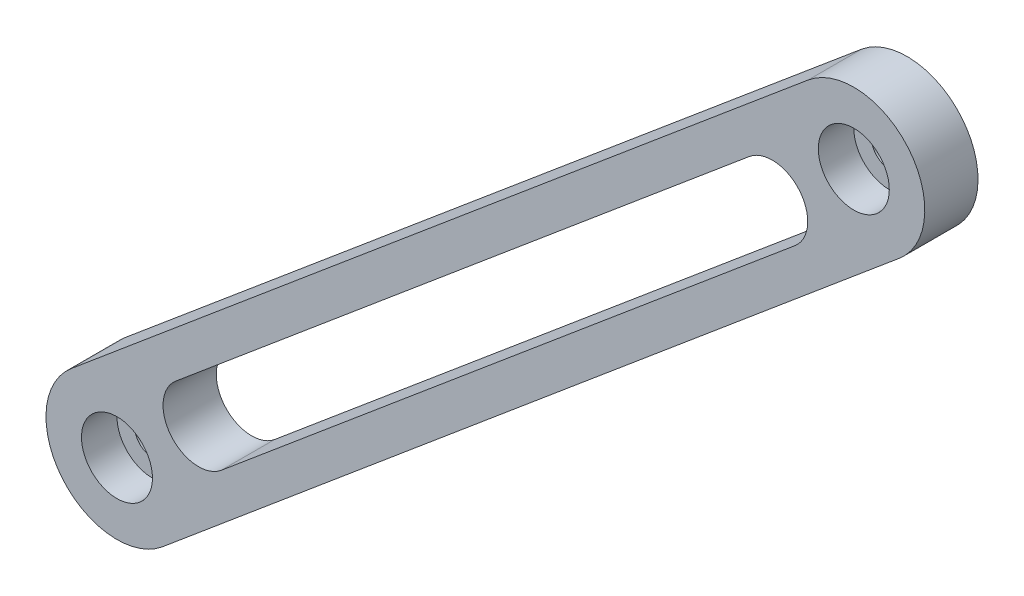
ISO-10303-21;
HEADER;
FILE_DESCRIPTION(('STEP AP214'),'2;1');
FILE_NAME('part.step','',(''),(''),'','','');
FILE_SCHEMA(('AUTOMOTIVE_DESIGN { 1 0 10303 214 1 1 1 1 }'));
ENDSEC;
DATA;
#1=APPLICATION_CONTEXT('core data for automotive mechanical design processes');
#2=APPLICATION_PROTOCOL_DEFINITION('international standard','automotive_design',2000,#1);
#3=PRODUCT_CONTEXT('',#1,'mechanical');
#4=PRODUCT('Part','Part','',(#3));
#5=PRODUCT_RELATED_PRODUCT_CATEGORY('part','',(#4));
#6=PRODUCT_DEFINITION_FORMATION('','',#4);
#7=PRODUCT_DEFINITION_CONTEXT('part definition',#1,'design');
#8=PRODUCT_DEFINITION('design','',#6,#7);
#9=PRODUCT_DEFINITION_SHAPE('','',#8);
#10=(LENGTH_UNIT() NAMED_UNIT(*) SI_UNIT(.MILLI.,.METRE.));
#11=(NAMED_UNIT(*) PLANE_ANGLE_UNIT() SI_UNIT($,.RADIAN.));
#12=(NAMED_UNIT(*) SI_UNIT($,.STERADIAN.) SOLID_ANGLE_UNIT());
#13=UNCERTAINTY_MEASURE_WITH_UNIT(LENGTH_MEASURE(1.E-05),#10,'distance_accuracy_value','');
#14=(GEOMETRIC_REPRESENTATION_CONTEXT(3) GLOBAL_UNCERTAINTY_ASSIGNED_CONTEXT((#13)) GLOBAL_UNIT_ASSIGNED_CONTEXT((#10,
#11,#12)) REPRESENTATION_CONTEXT('',''));
#15=CARTESIAN_POINT('',(0.,0.,0.));
#16=DIRECTION('',(0.,0.,1.));
#17=DIRECTION('',(1.,0.,0.));
#18=AXIS2_PLACEMENT_3D('',#15,#16,#17);
#19=CARTESIAN_POINT('',(584.67196600747,483.799194713962,19.05));
#20=DIRECTION('',(0.,0.,-1.));
#21=DIRECTION('',(-1.,0.,0.));
#22=AXIS2_PLACEMENT_3D('',#19,#20,#21);
#23=CYLINDRICAL_SURFACE('',#22,6.34999999999994);
#24=CARTESIAN_POINT('',(584.67196600747,483.799194713962,0.));
#25=DIRECTION('',(0.,0.,1.));
#26=DIRECTION('',(1.,0.,0.));
#27=AXIS2_PLACEMENT_3D('',#24,#25,#26);
#28=CIRCLE('',#27,6.34999999999994);
#29=CARTESIAN_POINT('',(578.32196600747,483.799194713962,0.));
#30=VERTEX_POINT('',#29);
#31=EDGE_CURVE('E119',#30,#30,#28,.T.);
#32=CARTESIAN_POINT('',(584.67196600747,483.799194713962,6.35));
#33=DIRECTION('',(0.,0.,1.));
#34=DIRECTION('',(1.,0.,0.));
#35=AXIS2_PLACEMENT_3D('',#32,#33,#34);
#36=CIRCLE('',#35,6.34999999999994);
#37=CARTESIAN_POINT('',(578.32196600747,483.799194713962,6.35));
#38=VERTEX_POINT('',#37);
#39=EDGE_CURVE('E40',#38,#38,#36,.T.);
#40=CARTESIAN_POINT('',(578.32196600747,483.799194713962,0.));
#41=CARTESIAN_POINT('',(578.32196600747,483.799194713962,0.0661458333333329));
#42=CARTESIAN_POINT('',(578.32196600747,483.799194713962,0.132291666666666));
#43=CARTESIAN_POINT('',(578.32196600747,483.799194713962,0.264583333333333));
#44=CARTESIAN_POINT('',(578.32196600747,483.799194713962,0.330729166666667));
#45=CARTESIAN_POINT('',(578.32196600747,483.799194713962,0.463020833333334));
#46=CARTESIAN_POINT('',(578.32196600747,483.799194713962,0.529166666666667));
#47=CARTESIAN_POINT('',(578.32196600747,483.799194713962,0.661458333333333));
#48=CARTESIAN_POINT('',(578.32196600747,483.799194713962,0.727604166666666));
#49=CARTESIAN_POINT('',(578.32196600747,483.799194713962,0.859895833333334));
#50=CARTESIAN_POINT('',(578.32196600747,483.799194713962,0.926041666666668));
#51=CARTESIAN_POINT('',(578.32196600747,483.799194713962,1.05833333333333));
#52=CARTESIAN_POINT('',(578.32196600747,483.799194713962,1.12447916666667));
#53=CARTESIAN_POINT('',(578.32196600747,483.799194713962,1.25677083333333));
#54=CARTESIAN_POINT('',(578.32196600747,483.799194713962,1.32291666666667));
#55=CARTESIAN_POINT('',(578.32196600747,483.799194713962,1.45520833333333));
#56=CARTESIAN_POINT('',(578.32196600747,483.799194713962,1.52135416666667));
#57=CARTESIAN_POINT('',(578.32196600747,483.799194713962,1.65364583333333));
#58=CARTESIAN_POINT('',(578.32196600747,483.799194713962,1.71979166666667));
#59=CARTESIAN_POINT('',(578.32196600747,483.799194713962,1.85208333333333));
#60=CARTESIAN_POINT('',(578.32196600747,483.799194713962,1.91822916666667));
#61=CARTESIAN_POINT('',(578.32196600747,483.799194713962,2.05052083333333));
#62=CARTESIAN_POINT('',(578.32196600747,483.799194713962,2.11666666666667));
#63=CARTESIAN_POINT('',(578.32196600747,483.799194713962,2.24895833333333));
#64=CARTESIAN_POINT('',(578.32196600747,483.799194713962,2.31510416666667));
#65=CARTESIAN_POINT('',(578.32196600747,483.799194713962,2.44739583333333));
#66=CARTESIAN_POINT('',(578.32196600747,483.799194713962,2.51354166666667));
#67=CARTESIAN_POINT('',(578.32196600747,483.799194713962,2.64583333333333));
#68=CARTESIAN_POINT('',(578.32196600747,483.799194713962,2.71197916666667));
#69=CARTESIAN_POINT('',(578.32196600747,483.799194713962,2.84427083333333));
#70=CARTESIAN_POINT('',(578.32196600747,483.799194713962,2.91041666666667));
#71=CARTESIAN_POINT('',(578.32196600747,483.799194713962,3.04270833333333));
#72=CARTESIAN_POINT('',(578.32196600747,483.799194713962,3.10885416666667));
#73=CARTESIAN_POINT('',(578.32196600747,483.799194713962,3.24114583333333));
#74=CARTESIAN_POINT('',(578.32196600747,483.799194713962,3.30729166666667));
#75=CARTESIAN_POINT('',(578.32196600747,483.799194713962,3.43958333333333));
#76=CARTESIAN_POINT('',(578.32196600747,483.799194713962,3.50572916666667));
#77=CARTESIAN_POINT('',(578.32196600747,483.799194713962,3.63802083333333));
#78=CARTESIAN_POINT('',(578.32196600747,483.799194713962,3.70416666666667));
#79=CARTESIAN_POINT('',(578.32196600747,483.799194713962,3.83645833333333));
#80=CARTESIAN_POINT('',(578.32196600747,483.799194713962,3.90260416666667));
#81=CARTESIAN_POINT('',(578.32196600747,483.799194713962,4.03489583333333));
#82=CARTESIAN_POINT('',(578.32196600747,483.799194713962,4.10104166666667));
#83=CARTESIAN_POINT('',(578.32196600747,483.799194713962,4.23333333333333));
#84=CARTESIAN_POINT('',(578.32196600747,483.799194713962,4.29947916666667));
#85=CARTESIAN_POINT('',(578.32196600747,483.799194713962,4.43177083333333));
#86=CARTESIAN_POINT('',(578.32196600747,483.799194713962,4.49791666666667));
#87=CARTESIAN_POINT('',(578.32196600747,483.799194713962,4.63020833333333));
#88=CARTESIAN_POINT('',(578.32196600747,483.799194713962,4.69635416666667));
#89=CARTESIAN_POINT('',(578.32196600747,483.799194713962,4.82864583333333));
#90=CARTESIAN_POINT('',(578.32196600747,483.799194713962,4.89479166666667));
#91=CARTESIAN_POINT('',(578.32196600747,483.799194713962,5.02708333333333));
#92=CARTESIAN_POINT('',(578.32196600747,483.799194713962,5.09322916666667));
#93=CARTESIAN_POINT('',(578.32196600747,483.799194713962,5.22552083333333));
#94=CARTESIAN_POINT('',(578.32196600747,483.799194713962,5.29166666666667));
#95=CARTESIAN_POINT('',(578.32196600747,483.799194713962,5.42395833333333));
#96=CARTESIAN_POINT('',(578.32196600747,483.799194713962,5.49010416666667));
#97=CARTESIAN_POINT('',(578.32196600747,483.799194713962,5.62239583333333));
#98=CARTESIAN_POINT('',(578.32196600747,483.799194713962,5.68854166666667));
#99=CARTESIAN_POINT('',(578.32196600747,483.799194713962,5.82083333333333));
#100=CARTESIAN_POINT('',(578.32196600747,483.799194713962,5.88697916666667));
#101=CARTESIAN_POINT('',(578.32196600747,483.799194713962,6.01927083333333));
#102=CARTESIAN_POINT('',(578.32196600747,483.799194713962,6.08541666666667));
#103=CARTESIAN_POINT('',(578.32196600747,483.799194713962,6.21770833333333));
#104=CARTESIAN_POINT('',(578.32196600747,483.799194713962,6.28385416666667));
#105=CARTESIAN_POINT('',(578.32196600747,483.799194713962,6.35));
#106=B_SPLINE_CURVE_WITH_KNOTS('',3,(#40,#41,#42,#43,#44,#45,#46,#47,#48,#49,#50,#51,#52,#53,
#54,#55,#56,#57,#58,#59,#60,#61,#62,#63,#64,#65,#66,#67,#68,#69,#70,#71,#72,#73,#74,#75,#76,#77,
#78,#79,#80,#81,#82,#83,#84,#85,#86,#87,#88,#89,#90,#91,#92,#93,#94,#95,#96,#97,#98,#99,#100,
#101,#102,#103,#104,#105),.UNSPECIFIED.,.F.,.F.,(4,2,2,2,2,2,2,2,2,2,2,2,2,2,2,2,2,2,2,2,2,2,2,
2,2,2,2,2,2,2,2,2,4),(0.,0.198437499999999,0.396875000000001,0.5953125,0.793749999999999,
0.992187500000002,1.190625,1.3890625,1.5875,1.7859375,1.984375,2.1828125,2.38125,2.5796875,
2.778125,2.9765625,3.175,3.3734375,3.571875,3.7703125,3.96875,4.1671875,4.365625,4.5640625,
4.7625,4.9609375,5.159375,5.3578125,5.55625,5.7546875,5.953125,6.1515625,6.35),.UNSPECIFIED.);
#107=EDGE_CURVE('BSEAM36',#30,#38,#106,.T.);
#108=ORIENTED_EDGE('',*,*,#31,.F.);
#109=ORIENTED_EDGE('',*,*,#39,.T.);
#110=ORIENTED_EDGE('',*,*,#107,.T.);
#111=ORIENTED_EDGE('',*,*,#107,.F.);
#112=EDGE_LOOP('',(#108,#110,#109,#111));
#113=FACE_BOUND('',#112,.T.);
#114=ADVANCED_FACE('F36',(#113),#23,.F.);
#115=CARTESIAN_POINT('',(321.022448189193,262.570981552578,19.05));
#116=DIRECTION('',(0.,0.,-1.));
#117=DIRECTION('',(-1.,0.,0.));
#118=AXIS2_PLACEMENT_3D('',#115,#116,#117);
#119=CYLINDRICAL_SURFACE('',#118,6.34999999999994);
#120=CARTESIAN_POINT('',(321.022448189193,262.570981552578,0.));
#121=DIRECTION('',(0.,0.,1.));
#122=DIRECTION('',(1.,0.,0.));
#123=AXIS2_PLACEMENT_3D('',#120,#121,#122);
#124=CIRCLE('',#123,6.34999999999994);
#125=CARTESIAN_POINT('',(314.672448189193,262.570981552578,0.));
#126=VERTEX_POINT('',#125);
#127=EDGE_CURVE('E133',#126,#126,#124,.T.);
#128=CARTESIAN_POINT('',(321.022448189193,262.570981552578,6.35));
#129=DIRECTION('',(0.,0.,1.));
#130=DIRECTION('',(1.,0.,0.));
#131=AXIS2_PLACEMENT_3D('',#128,#129,#130);
#132=CIRCLE('',#131,6.34999999999994);
#133=CARTESIAN_POINT('',(314.672448189193,262.570981552578,6.35));
#134=VERTEX_POINT('',#133);
#135=EDGE_CURVE('E170',#134,#134,#132,.T.);
#136=CARTESIAN_POINT('',(314.672448189193,262.570981552578,0.));
#137=CARTESIAN_POINT('',(314.672448189193,262.570981552578,0.0661458333333329));
#138=CARTESIAN_POINT('',(314.672448189193,262.570981552578,0.132291666666666));
#139=CARTESIAN_POINT('',(314.672448189193,262.570981552578,0.264583333333333));
#140=CARTESIAN_POINT('',(314.672448189193,262.570981552578,0.330729166666667));
#141=CARTESIAN_POINT('',(314.672448189193,262.570981552578,0.463020833333334));
#142=CARTESIAN_POINT('',(314.672448189193,262.570981552578,0.529166666666667));
#143=CARTESIAN_POINT('',(314.672448189193,262.570981552578,0.661458333333333));
#144=CARTESIAN_POINT('',(314.672448189193,262.570981552578,0.727604166666666));
#145=CARTESIAN_POINT('',(314.672448189193,262.570981552578,0.859895833333334));
#146=CARTESIAN_POINT('',(314.672448189193,262.570981552578,0.926041666666668));
#147=CARTESIAN_POINT('',(314.672448189193,262.570981552578,1.05833333333333));
#148=CARTESIAN_POINT('',(314.672448189193,262.570981552578,1.12447916666667));
#149=CARTESIAN_POINT('',(314.672448189193,262.570981552578,1.25677083333333));
#150=CARTESIAN_POINT('',(314.672448189193,262.570981552578,1.32291666666667));
#151=CARTESIAN_POINT('',(314.672448189193,262.570981552578,1.45520833333333));
#152=CARTESIAN_POINT('',(314.672448189193,262.570981552578,1.52135416666667));
#153=CARTESIAN_POINT('',(314.672448189193,262.570981552578,1.65364583333333));
#154=CARTESIAN_POINT('',(314.672448189193,262.570981552578,1.71979166666667));
#155=CARTESIAN_POINT('',(314.672448189193,262.570981552578,1.85208333333333));
#156=CARTESIAN_POINT('',(314.672448189193,262.570981552578,1.91822916666667));
#157=CARTESIAN_POINT('',(314.672448189193,262.570981552578,2.05052083333333));
#158=CARTESIAN_POINT('',(314.672448189193,262.570981552578,2.11666666666667));
#159=CARTESIAN_POINT('',(314.672448189193,262.570981552578,2.24895833333333));
#160=CARTESIAN_POINT('',(314.672448189193,262.570981552578,2.31510416666667));
#161=CARTESIAN_POINT('',(314.672448189193,262.570981552578,2.44739583333333));
#162=CARTESIAN_POINT('',(314.672448189193,262.570981552578,2.51354166666667));
#163=CARTESIAN_POINT('',(314.672448189193,262.570981552578,2.64583333333333));
#164=CARTESIAN_POINT('',(314.672448189193,262.570981552578,2.71197916666667));
#165=CARTESIAN_POINT('',(314.672448189193,262.570981552578,2.84427083333333));
#166=CARTESIAN_POINT('',(314.672448189193,262.570981552578,2.91041666666667));
#167=CARTESIAN_POINT('',(314.672448189193,262.570981552578,3.04270833333333));
#168=CARTESIAN_POINT('',(314.672448189193,262.570981552578,3.10885416666667));
#169=CARTESIAN_POINT('',(314.672448189193,262.570981552578,3.24114583333333));
#170=CARTESIAN_POINT('',(314.672448189193,262.570981552578,3.30729166666667));
#171=CARTESIAN_POINT('',(314.672448189193,262.570981552578,3.43958333333333));
#172=CARTESIAN_POINT('',(314.672448189193,262.570981552578,3.50572916666667));
#173=CARTESIAN_POINT('',(314.672448189193,262.570981552578,3.63802083333333));
#174=CARTESIAN_POINT('',(314.672448189193,262.570981552578,3.70416666666667));
#175=CARTESIAN_POINT('',(314.672448189193,262.570981552578,3.83645833333333));
#176=CARTESIAN_POINT('',(314.672448189193,262.570981552578,3.90260416666667));
#177=CARTESIAN_POINT('',(314.672448189193,262.570981552578,4.03489583333333));
#178=CARTESIAN_POINT('',(314.672448189193,262.570981552578,4.10104166666667));
#179=CARTESIAN_POINT('',(314.672448189193,262.570981552578,4.23333333333333));
#180=CARTESIAN_POINT('',(314.672448189193,262.570981552578,4.29947916666667));
#181=CARTESIAN_POINT('',(314.672448189193,262.570981552578,4.43177083333333));
#182=CARTESIAN_POINT('',(314.672448189193,262.570981552578,4.49791666666667));
#183=CARTESIAN_POINT('',(314.672448189193,262.570981552578,4.63020833333333));
#184=CARTESIAN_POINT('',(314.672448189193,262.570981552578,4.69635416666667));
#185=CARTESIAN_POINT('',(314.672448189193,262.570981552578,4.82864583333333));
#186=CARTESIAN_POINT('',(314.672448189193,262.570981552578,4.89479166666667));
#187=CARTESIAN_POINT('',(314.672448189193,262.570981552578,5.02708333333333));
#188=CARTESIAN_POINT('',(314.672448189193,262.570981552578,5.09322916666667));
#189=CARTESIAN_POINT('',(314.672448189193,262.570981552578,5.22552083333333));
#190=CARTESIAN_POINT('',(314.672448189193,262.570981552578,5.29166666666667));
#191=CARTESIAN_POINT('',(314.672448189193,262.570981552578,5.42395833333333));
#192=CARTESIAN_POINT('',(314.672448189193,262.570981552578,5.49010416666667));
#193=CARTESIAN_POINT('',(314.672448189193,262.570981552578,5.62239583333333));
#194=CARTESIAN_POINT('',(314.672448189193,262.570981552578,5.68854166666667));
#195=CARTESIAN_POINT('',(314.672448189193,262.570981552578,5.82083333333333));
#196=CARTESIAN_POINT('',(314.672448189193,262.570981552578,5.88697916666667));
#197=CARTESIAN_POINT('',(314.672448189193,262.570981552578,6.01927083333333));
#198=CARTESIAN_POINT('',(314.672448189193,262.570981552578,6.08541666666667));
#199=CARTESIAN_POINT('',(314.672448189193,262.570981552578,6.21770833333333));
#200=CARTESIAN_POINT('',(314.672448189193,262.570981552578,6.28385416666667));
#201=CARTESIAN_POINT('',(314.672448189193,262.570981552578,6.35));
#202=B_SPLINE_CURVE_WITH_KNOTS('',3,(#136,#137,#138,#139,#140,#141,#142,#143,#144,#145,#146,
#147,#148,#149,#150,#151,#152,#153,#154,#155,#156,#157,#158,#159,#160,#161,#162,#163,#164,#165,
#166,#167,#168,#169,#170,#171,#172,#173,#174,#175,#176,#177,#178,#179,#180,#181,#182,#183,#184,
#185,#186,#187,#188,#189,#190,#191,#192,#193,#194,#195,#196,#197,#198,#199,#200,#201),
.UNSPECIFIED.,.F.,.F.,(4,2,2,2,2,2,2,2,2,2,2,2,2,2,2,2,2,2,2,2,2,2,2,2,2,2,2,2,2,2,2,2,4),(0.,
0.198437499999999,0.396875000000001,0.5953125,0.793749999999999,0.992187500000002,1.190625,
1.3890625,1.5875,1.7859375,1.984375,2.1828125,2.38125,2.5796875,2.778125,2.9765625,3.175,
3.3734375,3.571875,3.7703125,3.96875,4.1671875,4.365625,4.5640625,4.7625,4.9609375,5.159375,
5.3578125,5.55625,5.7546875,5.953125,6.1515625,6.35),.UNSPECIFIED.);
#203=EDGE_CURVE('BSEAM194',#126,#134,#202,.T.);
#204=ORIENTED_EDGE('',*,*,#127,.F.);
#205=ORIENTED_EDGE('',*,*,#135,.T.);
#206=ORIENTED_EDGE('',*,*,#203,.T.);
#207=ORIENTED_EDGE('',*,*,#203,.F.);
#208=EDGE_LOOP('',(#204,#206,#205,#207));
#209=FACE_BOUND('',#208,.T.);
#210=ADVANCED_FACE('F194',(#209),#119,.F.);
#211=CARTESIAN_POINT('',(321.022450019211,262.570983088146,19.05));
#212=DIRECTION('',(0.,0.,1.));
#213=DIRECTION('',(1.,0.,0.));
#214=AXIS2_PLACEMENT_3D('',#211,#212,#213);
#215=PLANE('',#214);
#216=CARTESIAN_POINT('',(321.022448189193,262.570981552578,19.05));
#217=DIRECTION('',(0.,0.,1.));
#218=DIRECTION('',(1.,0.,0.));
#219=AXIS2_PLACEMENT_3D('',#216,#217,#218);
#220=CIRCLE('',#219,12.7);
#221=CARTESIAN_POINT('',(333.722448189193,262.570981552578,19.05));
#222=VERTEX_POINT('',#221);
#223=EDGE_CURVE('E177',#222,#222,#220,.T.);
#224=ORIENTED_EDGE('',*,*,#223,.F.);
#225=EDGE_LOOP('',(#224));
#226=FACE_BOUND('',#225,.T.);
#227=CARTESIAN_POINT('',(584.67196600747,483.799194713962,19.05));
#228=DIRECTION('',(0.,0.,1.));
#229=DIRECTION('',(1.,0.,0.));
#230=AXIS2_PLACEMENT_3D('',#227,#228,#229);
#231=CIRCLE('',#230,12.7);
#232=CARTESIAN_POINT('',(597.37196600747,483.799194713962,19.05));
#233=VERTEX_POINT('',#232);
#234=EDGE_CURVE('E187',#233,#233,#231,.T.);
#235=ORIENTED_EDGE('',*,*,#234,.F.);
#236=EDGE_LOOP('',(#235));
#237=FACE_BOUND('',#236,.T.);
#238=DIRECTION('',(-0.766044443118976,-0.642787609686541,0.));
#239=VECTOR('',#238,1.);
#240=CARTESIAN_POINT('',(547.322270081617,469.037751212516,19.05));
#241=LINE('',#240,#239);
#242=CARTESIAN_POINT('',(547.322270081617,469.037751212516,19.05));
#243=VERTEX_POINT('',#242);
#244=CARTESIAN_POINT('',(342.045340659025,296.789955444813,19.05));
#245=VERTEX_POINT('',#244);
#246=EDGE_CURVE('E111',#243,#245,#241,.T.);
#247=ORIENTED_EDGE('',*,*,#246,.F.);
#248=CARTESIAN_POINT('',(555.485672724636,459.308986784905,19.05));
#249=DIRECTION('',(0.,0.,1.));
#250=DIRECTION('',(1.,0.,0.));
#251=AXIS2_PLACEMENT_3D('',#248,#249,#250);
#252=CIRCLE('',#251,12.6999999999998);
#253=CARTESIAN_POINT('',(563.649075367655,449.580222357294,19.05));
#254=VERTEX_POINT('',#253);
#255=EDGE_CURVE('E103',#254,#243,#252,.T.);
#256=ORIENTED_EDGE('',*,*,#255,.F.);
#257=DIRECTION('',(0.766044443118976,0.642787609686542,0.));
#258=VECTOR('',#257,1.);
#259=CARTESIAN_POINT('',(563.649075367655,449.580222357294,19.05));
#260=LINE('',#259,#258);
#261=CARTESIAN_POINT('',(358.372145945064,277.332426589591,19.05));
#262=VERTEX_POINT('',#261);
#263=EDGE_CURVE('E127',#262,#254,#260,.T.);
#264=ORIENTED_EDGE('',*,*,#263,.F.);
#265=CARTESIAN_POINT('',(350.208743302045,287.061191017202,19.05));
#266=DIRECTION('',(0.,0.,1.));
#267=DIRECTION('',(1.,0.,0.));
#268=AXIS2_PLACEMENT_3D('',#265,#266,#267);
#269=CIRCLE('',#268,12.6999999999999);
#270=EDGE_CURVE('E125',#245,#262,#269,.T.);
#271=ORIENTED_EDGE('',*,*,#270,.F.);
#272=EDGE_LOOP('',(#247,#256,#264,#271));
#273=FACE_BOUND('',#272,.T.);
#274=CARTESIAN_POINT('',(321.022450019211,262.570983088146,19.05));
#275=DIRECTION('',(0.,0.,1.));
#276=DIRECTION('',(1.,0.,0.));
#277=AXIS2_PLACEMENT_3D('',#274,#275,#276);
#278=CIRCLE('',#277,25.4000000000003);
#279=CARTESIAN_POINT('',(304.695644733173,282.028511943368,19.05));
#280=VERTEX_POINT('',#279);
#281=CARTESIAN_POINT('',(337.349251645213,243.113451161788,19.05));
#282=VERTEX_POINT('',#281);
#283=EDGE_CURVE('E146',#280,#282,#278,.T.);
#284=ORIENTED_EDGE('',*,*,#283,.T.);
#285=DIRECTION('',(0.766044443118978,0.64278760968654,0.));
#286=VECTOR('',#285,1.);
#287=CARTESIAN_POINT('',(600.998771293508,464.34166585874,19.05));
#288=LINE('',#287,#286);
#289=CARTESIAN_POINT('',(600.998771293508,464.34166585874,19.05));
#290=VERTEX_POINT('',#289);
#291=EDGE_CURVE('E149',#282,#290,#288,.T.);
#292=ORIENTED_EDGE('',*,*,#291,.T.);
#293=CARTESIAN_POINT('',(584.67196600747,483.799194713962,19.05));
#294=DIRECTION('',(0.,0.,1.));
#295=DIRECTION('',(-1.,0.,0.));
#296=AXIS2_PLACEMENT_3D('',#293,#294,#295);
#297=CIRCLE('',#296,25.4);
#298=CARTESIAN_POINT('',(568.345160721432,503.256723569184,19.05));
#299=VERTEX_POINT('',#298);
#300=EDGE_CURVE('E152',#290,#299,#297,.T.);
#301=ORIENTED_EDGE('',*,*,#300,.T.);
#302=DIRECTION('',(-0.766044443118978,-0.642787609686539,0.));
#303=VECTOR('',#302,1.);
#304=CARTESIAN_POINT('',(568.345160721432,503.256723569184,19.05));
#305=LINE('',#304,#303);
#306=EDGE_CURVE('E154',#299,#280,#305,.T.);
#307=ORIENTED_EDGE('',*,*,#306,.T.);
#308=EDGE_LOOP('',(#284,#292,#301,#307));
#309=FACE_BOUND('',#308,.T.);
#310=ADVANCED_FACE('F123',(#226,#237,#273,#309),#215,.T.);
#311=CARTESIAN_POINT('',(321.022450019211,262.570983088146,0.));
#312=DIRECTION('',(0.,0.,1.));
#313=DIRECTION('',(1.,0.,0.));
#314=AXIS2_PLACEMENT_3D('',#311,#312,#313);
#315=PLANE('',#314);
#316=ORIENTED_EDGE('',*,*,#31,.T.);
#317=EDGE_LOOP('',(#316));
#318=FACE_BOUND('',#317,.T.);
#319=CARTESIAN_POINT('',(321.022450019211,262.570983088146,0.));
#320=DIRECTION('',(0.,0.,1.));
#321=DIRECTION('',(1.,0.,0.));
#322=AXIS2_PLACEMENT_3D('',#319,#320,#321);
#323=CIRCLE('',#322,25.4000000000003);
#324=CARTESIAN_POINT('',(304.695644733173,282.028511943368,0.));
#325=VERTEX_POINT('',#324);
#326=CARTESIAN_POINT('',(337.349251645213,243.113451161788,0.));
#327=VERTEX_POINT('',#326);
#328=EDGE_CURVE('E145',#325,#327,#323,.T.);
#329=ORIENTED_EDGE('',*,*,#328,.F.);
#330=DIRECTION('',(-0.766044443118978,-0.642787609686539,0.));
#331=VECTOR('',#330,1.);
#332=CARTESIAN_POINT('',(568.345160721432,503.256723569184,0.));
#333=LINE('',#332,#331);
#334=CARTESIAN_POINT('',(568.345160721432,503.256723569184,0.));
#335=VERTEX_POINT('',#334);
#336=EDGE_CURVE('E150',#335,#325,#333,.T.);
#337=ORIENTED_EDGE('',*,*,#336,.F.);
#338=CARTESIAN_POINT('',(584.67196600747,483.799194713962,0.));
#339=DIRECTION('',(0.,0.,1.));
#340=DIRECTION('',(-1.,0.,0.));
#341=AXIS2_PLACEMENT_3D('',#338,#339,#340);
#342=CIRCLE('',#341,25.4);
#343=CARTESIAN_POINT('',(600.998771293508,464.34166585874,0.));
#344=VERTEX_POINT('',#343);
#345=EDGE_CURVE('E161',#344,#335,#342,.T.);
#346=ORIENTED_EDGE('',*,*,#345,.F.);
#347=DIRECTION('',(0.766044443118978,0.64278760968654,0.));
#348=VECTOR('',#347,1.);
#349=CARTESIAN_POINT('',(600.998771293508,464.34166585874,0.));
#350=LINE('',#349,#348);
#351=EDGE_CURVE('E159',#327,#344,#350,.T.);
#352=ORIENTED_EDGE('',*,*,#351,.F.);
#353=EDGE_LOOP('',(#329,#337,#346,#352));
#354=FACE_BOUND('',#353,.T.);
#355=CARTESIAN_POINT('',(555.485672724636,459.308986784905,0.));
#356=DIRECTION('',(0.,0.,1.));
#357=DIRECTION('',(1.,0.,0.));
#358=AXIS2_PLACEMENT_3D('',#355,#356,#357);
#359=CIRCLE('',#358,12.6999999999998);
#360=CARTESIAN_POINT('',(563.649075367655,449.580222357294,0.));
#361=VERTEX_POINT('',#360);
#362=CARTESIAN_POINT('',(547.322270081617,469.037751212516,0.));
#363=VERTEX_POINT('',#362);
#364=EDGE_CURVE('E61',#361,#363,#359,.T.);
#365=ORIENTED_EDGE('',*,*,#364,.T.);
#366=DIRECTION('',(-0.766044443118976,-0.642787609686541,0.));
#367=VECTOR('',#366,1.);
#368=CARTESIAN_POINT('',(547.322270081617,469.037751212516,0.));
#369=LINE('',#368,#367);
#370=CARTESIAN_POINT('',(342.045340659025,296.789955444813,0.));
#371=VERTEX_POINT('',#370);
#372=EDGE_CURVE('E118',#363,#371,#369,.T.);
#373=ORIENTED_EDGE('',*,*,#372,.T.);
#374=CARTESIAN_POINT('',(350.208743302045,287.061191017202,0.));
#375=DIRECTION('',(0.,0.,1.));
#376=DIRECTION('',(1.,0.,0.));
#377=AXIS2_PLACEMENT_3D('',#374,#375,#376);
#378=CIRCLE('',#377,12.6999999999999);
#379=CARTESIAN_POINT('',(358.372145945064,277.332426589591,0.));
#380=VERTEX_POINT('',#379);
#381=EDGE_CURVE('E135',#371,#380,#378,.T.);
#382=ORIENTED_EDGE('',*,*,#381,.T.);
#383=DIRECTION('',(0.766044443118976,0.642787609686542,0.));
#384=VECTOR('',#383,1.);
#385=CARTESIAN_POINT('',(563.649075367655,449.580222357294,0.));
#386=LINE('',#385,#384);
#387=EDGE_CURVE('E112',#380,#361,#386,.T.);
#388=ORIENTED_EDGE('',*,*,#387,.T.);
#389=EDGE_LOOP('',(#365,#373,#382,#388));
#390=FACE_BOUND('',#389,.T.);
#391=ORIENTED_EDGE('',*,*,#127,.T.);
#392=EDGE_LOOP('',(#391));
#393=FACE_BOUND('',#392,.T.);
#394=ADVANCED_FACE('F192',(#318,#354,#390,#393),#315,.F.);
#395=CARTESIAN_POINT('',(321.022450019211,262.570983088146,19.05));
#396=DIRECTION('',(0.,0.,-1.));
#397=DIRECTION('',(-1.,0.,0.));
#398=AXIS2_PLACEMENT_3D('',#395,#396,#397);
#399=CYLINDRICAL_SURFACE('',#398,25.4000000000003);
#400=ORIENTED_EDGE('',*,*,#328,.T.);
#401=DIRECTION('',(0.,0.,-1.));
#402=VECTOR('',#401,1.);
#403=CARTESIAN_POINT('',(337.349251645213,243.113451161788,19.05));
#404=LINE('',#403,#402);
#405=EDGE_CURVE('E11',#282,#327,#404,.T.);
#406=ORIENTED_EDGE('',*,*,#405,.F.);
#407=ORIENTED_EDGE('',*,*,#283,.F.);
#408=DIRECTION('',(0.,0.,-1.));
#409=VECTOR('',#408,1.);
#410=CARTESIAN_POINT('',(304.695644733173,282.028511943368,19.05));
#411=LINE('',#410,#409);
#412=EDGE_CURVE('E156',#280,#325,#411,.T.);
#413=ORIENTED_EDGE('',*,*,#412,.T.);
#414=EDGE_LOOP('',(#400,#406,#407,#413));
#415=FACE_BOUND('',#414,.T.);
#416=ADVANCED_FACE('F38',(#415),#399,.T.);
#417=CARTESIAN_POINT('',(600.998771293508,464.34166585874,19.05));
#418=DIRECTION('',(-0.64278760968654,0.766044443118978,0.));
#419=DIRECTION('',(-0.766044443118978,-0.64278760968654,0.));
#420=AXIS2_PLACEMENT_3D('',#417,#418,#419);
#421=PLANE('',#420);
#422=ORIENTED_EDGE('',*,*,#351,.T.);
#423=DIRECTION('',(0.,0.,-1.));
#424=VECTOR('',#423,1.);
#425=CARTESIAN_POINT('',(600.998771293508,464.34166585874,19.05));
#426=LINE('',#425,#424);
#427=EDGE_CURVE('E45',#290,#344,#426,.T.);
#428=ORIENTED_EDGE('',*,*,#427,.F.);
#429=ORIENTED_EDGE('',*,*,#291,.F.);
#430=ORIENTED_EDGE('',*,*,#405,.T.);
#431=EDGE_LOOP('',(#422,#428,#429,#430));
#432=FACE_BOUND('',#431,.T.);
#433=ADVANCED_FACE('F230',(#432),#421,.F.);
#434=CARTESIAN_POINT('',(584.67196600747,483.799194713962,19.05));
#435=DIRECTION('',(0.,0.,-1.));
#436=DIRECTION('',(-1.,0.,0.));
#437=AXIS2_PLACEMENT_3D('',#434,#435,#436);
#438=CYLINDRICAL_SURFACE('',#437,25.4);
#439=ORIENTED_EDGE('',*,*,#345,.T.);
#440=DIRECTION('',(0.,0.,-1.));
#441=VECTOR('',#440,1.);
#442=CARTESIAN_POINT('',(568.345160721432,503.256723569184,19.05));
#443=LINE('',#442,#441);
#444=EDGE_CURVE('E166',#299,#335,#443,.T.);
#445=ORIENTED_EDGE('',*,*,#444,.F.);
#446=ORIENTED_EDGE('',*,*,#300,.F.);
#447=ORIENTED_EDGE('',*,*,#427,.T.);
#448=EDGE_LOOP('',(#439,#445,#446,#447));
#449=FACE_BOUND('',#448,.T.);
#450=ADVANCED_FACE('F227',(#449),#438,.T.);
#451=CARTESIAN_POINT('',(568.345160721432,503.256723569184,19.05));
#452=DIRECTION('',(0.642787609686539,-0.766044443118978,0.));
#453=DIRECTION('',(0.766044443118978,0.642787609686539,0.));
#454=AXIS2_PLACEMENT_3D('',#451,#452,#453);
#455=PLANE('',#454);
#456=ORIENTED_EDGE('',*,*,#336,.T.);
#457=ORIENTED_EDGE('',*,*,#412,.F.);
#458=ORIENTED_EDGE('',*,*,#306,.F.);
#459=ORIENTED_EDGE('',*,*,#444,.T.);
#460=EDGE_LOOP('',(#456,#457,#458,#459));
#461=FACE_BOUND('',#460,.T.);
#462=ADVANCED_FACE('F220',(#461),#455,.F.);
#463=CARTESIAN_POINT('',(555.485672724636,459.308986784905,19.05));
#464=DIRECTION('',(0.,0.,-1.));
#465=DIRECTION('',(-1.,0.,0.));
#466=AXIS2_PLACEMENT_3D('',#463,#464,#465);
#467=CYLINDRICAL_SURFACE('',#466,12.6999999999998);
#468=ORIENTED_EDGE('',*,*,#364,.F.);
#469=DIRECTION('',(0.,0.,-1.));
#470=VECTOR('',#469,1.);
#471=CARTESIAN_POINT('',(563.649075367655,449.580222357294,19.05));
#472=LINE('',#471,#470);
#473=EDGE_CURVE('E107',#254,#361,#472,.T.);
#474=ORIENTED_EDGE('',*,*,#473,.F.);
#475=ORIENTED_EDGE('',*,*,#255,.T.);
#476=DIRECTION('',(0.,0.,-1.));
#477=VECTOR('',#476,1.);
#478=CARTESIAN_POINT('',(547.322270081617,469.037751212516,19.05));
#479=LINE('',#478,#477);
#480=EDGE_CURVE('E106',#243,#363,#479,.T.);
#481=ORIENTED_EDGE('',*,*,#480,.T.);
#482=EDGE_LOOP('',(#468,#474,#475,#481));
#483=FACE_BOUND('',#482,.T.);
#484=ADVANCED_FACE('F105',(#483),#467,.F.);
#485=CARTESIAN_POINT('',(547.322270081617,469.037751212516,19.05));
#486=DIRECTION('',(0.642787609686541,-0.766044443118976,0.));
#487=DIRECTION('',(0.766044443118977,0.642787609686541,0.));
#488=AXIS2_PLACEMENT_3D('',#485,#486,#487);
#489=PLANE('',#488);
#490=ORIENTED_EDGE('',*,*,#372,.F.);
#491=ORIENTED_EDGE('',*,*,#480,.F.);
#492=ORIENTED_EDGE('',*,*,#246,.T.);
#493=DIRECTION('',(0.,0.,-1.));
#494=VECTOR('',#493,1.);
#495=CARTESIAN_POINT('',(342.045340659025,296.789955444813,19.05));
#496=LINE('',#495,#494);
#497=EDGE_CURVE('E120',#245,#371,#496,.T.);
#498=ORIENTED_EDGE('',*,*,#497,.T.);
#499=EDGE_LOOP('',(#490,#491,#492,#498));
#500=FACE_BOUND('',#499,.T.);
#501=ADVANCED_FACE('F115',(#500),#489,.T.);
#502=CARTESIAN_POINT('',(350.208743302045,287.061191017202,19.05));
#503=DIRECTION('',(0.,0.,-1.));
#504=DIRECTION('',(-1.,0.,0.));
#505=AXIS2_PLACEMENT_3D('',#502,#503,#504);
#506=CYLINDRICAL_SURFACE('',#505,12.6999999999999);
#507=ORIENTED_EDGE('',*,*,#381,.F.);
#508=ORIENTED_EDGE('',*,*,#497,.F.);
#509=ORIENTED_EDGE('',*,*,#270,.T.);
#510=DIRECTION('',(0.,0.,-1.));
#511=VECTOR('',#510,1.);
#512=CARTESIAN_POINT('',(358.372145945064,277.332426589591,19.05));
#513=LINE('',#512,#511);
#514=EDGE_CURVE('E53',#262,#380,#513,.T.);
#515=ORIENTED_EDGE('',*,*,#514,.T.);
#516=EDGE_LOOP('',(#507,#508,#509,#515));
#517=FACE_BOUND('',#516,.T.);
#518=ADVANCED_FACE('F213',(#517),#506,.F.);
#519=CARTESIAN_POINT('',(563.649075367655,449.580222357294,19.05));
#520=DIRECTION('',(-0.642787609686542,0.766044443118976,0.));
#521=DIRECTION('',(-0.766044443118976,-0.642787609686542,0.));
#522=AXIS2_PLACEMENT_3D('',#519,#520,#521);
#523=PLANE('',#522);
#524=ORIENTED_EDGE('',*,*,#387,.F.);
#525=ORIENTED_EDGE('',*,*,#514,.F.);
#526=ORIENTED_EDGE('',*,*,#263,.T.);
#527=ORIENTED_EDGE('',*,*,#473,.T.);
#528=EDGE_LOOP('',(#524,#525,#526,#527));
#529=FACE_BOUND('',#528,.T.);
#530=ADVANCED_FACE('F209',(#529),#523,.T.);
#531=CARTESIAN_POINT('',(321.022448189193,262.570981552578,6.35));
#532=DIRECTION('',(0.,0.,1.));
#533=DIRECTION('',(1.,0.,0.));
#534=AXIS2_PLACEMENT_3D('',#531,#532,#533);
#535=CYLINDRICAL_SURFACE('',#534,12.7);
#536=CARTESIAN_POINT('',(321.022448189193,262.570981552578,6.35));
#537=DIRECTION('',(0.,0.,1.));
#538=DIRECTION('',(1.,0.,0.));
#539=AXIS2_PLACEMENT_3D('',#536,#537,#538);
#540=CIRCLE('',#539,12.7);
#541=CARTESIAN_POINT('',(333.722448189193,262.570981552578,6.35));
#542=VERTEX_POINT('',#541);
#543=EDGE_CURVE('E172',#542,#542,#540,.T.);
#544=ORIENTED_EDGE('',*,*,#543,.F.);
#545=EDGE_LOOP('',(#544));
#546=FACE_BOUND('',#545,.T.);
#547=ORIENTED_EDGE('',*,*,#223,.T.);
#548=EDGE_LOOP('',(#547));
#549=FACE_BOUND('',#548,.T.);
#550=ADVANCED_FACE('F212',(#546,#549),#535,.F.);
#551=CARTESIAN_POINT('',(321.022448189193,262.570981552578,6.35));
#552=DIRECTION('',(0.,0.,1.));
#553=DIRECTION('',(1.,0.,0.));
#554=AXIS2_PLACEMENT_3D('',#551,#552,#553);
#555=PLANE('',#554);
#556=ORIENTED_EDGE('',*,*,#135,.F.);
#557=EDGE_LOOP('',(#556));
#558=FACE_BOUND('',#557,.T.);
#559=ORIENTED_EDGE('',*,*,#543,.T.);
#560=EDGE_LOOP('',(#559));
#561=FACE_BOUND('',#560,.T.);
#562=ADVANCED_FACE('F273',(#558,#561),#555,.T.);
#563=CARTESIAN_POINT('',(584.67196600747,483.799194713962,6.35));
#564=DIRECTION('',(0.,0.,1.));
#565=DIRECTION('',(1.,0.,0.));
#566=AXIS2_PLACEMENT_3D('',#563,#564,#565);
#567=CYLINDRICAL_SURFACE('',#566,12.7);
#568=CARTESIAN_POINT('',(584.67196600747,483.799194713962,6.35));
#569=DIRECTION('',(0.,0.,1.));
#570=DIRECTION('',(1.,0.,0.));
#571=AXIS2_PLACEMENT_3D('',#568,#569,#570);
#572=CIRCLE('',#571,12.7);
#573=CARTESIAN_POINT('',(597.37196600747,483.799194713962,6.35));
#574=VERTEX_POINT('',#573);
#575=EDGE_CURVE('E182',#574,#574,#572,.T.);
#576=ORIENTED_EDGE('',*,*,#575,.F.);
#577=EDGE_LOOP('',(#576));
#578=FACE_BOUND('',#577,.T.);
#579=ORIENTED_EDGE('',*,*,#234,.T.);
#580=EDGE_LOOP('',(#579));
#581=FACE_BOUND('',#580,.T.);
#582=ADVANCED_FACE('F207',(#578,#581),#567,.F.);
#583=CARTESIAN_POINT('',(584.67196600747,483.799194713962,6.35));
#584=DIRECTION('',(0.,0.,1.));
#585=DIRECTION('',(1.,0.,0.));
#586=AXIS2_PLACEMENT_3D('',#583,#584,#585);
#587=PLANE('',#586);
#588=ORIENTED_EDGE('',*,*,#39,.F.);
#589=EDGE_LOOP('',(#588));
#590=FACE_BOUND('',#589,.T.);
#591=ORIENTED_EDGE('',*,*,#575,.T.);
#592=EDGE_LOOP('',(#591));
#593=FACE_BOUND('',#592,.T.);
#594=ADVANCED_FACE('F293',(#590,#593),#587,.T.);
#595=CLOSED_SHELL('',(#114,#210,#310,#394,#416,#433,#450,#462,#484,#501,#518,#530,#550,#562,
#582,#594));
#596=MANIFOLD_SOLID_BREP('B2',#595);
#597=ADVANCED_BREP_SHAPE_REPRESENTATION('',(#18,#596),#14);
#598=SHAPE_DEFINITION_REPRESENTATION(#9,#597);
ENDSEC;
END-ISO-10303-21;
